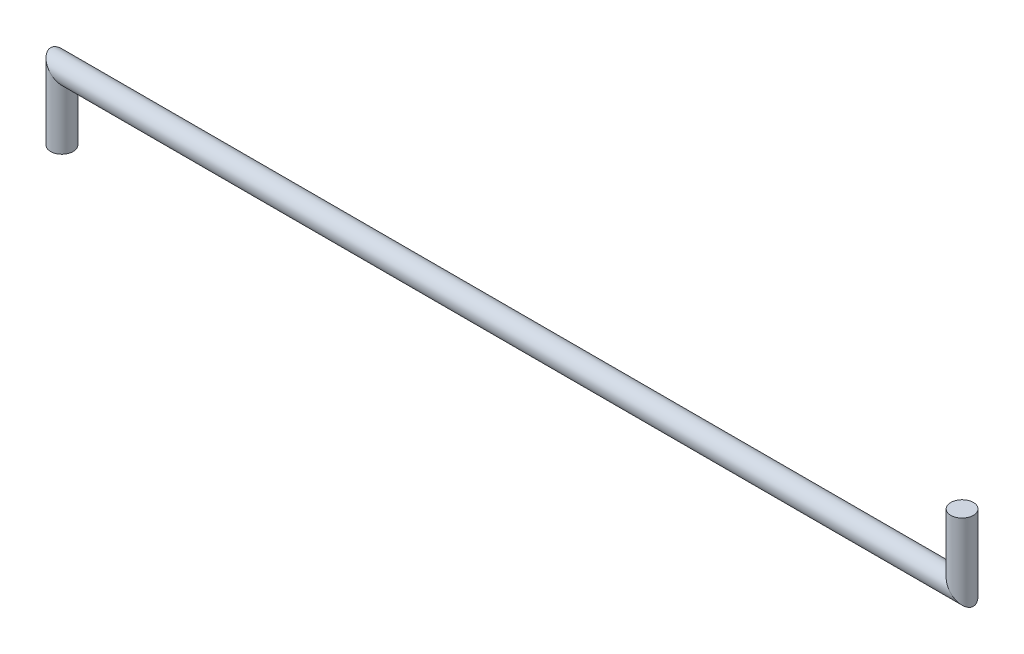
ISO-10303-21;
HEADER;
FILE_DESCRIPTION(('STEP AP214'),'2;1');
FILE_NAME('part.step','',(''),(''),'','','');
FILE_SCHEMA(('AUTOMOTIVE_DESIGN { 1 0 10303 214 1 1 1 1 }'));
ENDSEC;
DATA;
#1=APPLICATION_CONTEXT('core data for automotive mechanical design processes');
#2=APPLICATION_PROTOCOL_DEFINITION('international standard','automotive_design',2000,#1);
#3=PRODUCT_CONTEXT('',#1,'mechanical');
#4=PRODUCT('Part','Part','',(#3));
#5=PRODUCT_RELATED_PRODUCT_CATEGORY('part','',(#4));
#6=PRODUCT_DEFINITION_FORMATION('','',#4);
#7=PRODUCT_DEFINITION_CONTEXT('part definition',#1,'design');
#8=PRODUCT_DEFINITION('design','',#6,#7);
#9=PRODUCT_DEFINITION_SHAPE('','',#8);
#10=(LENGTH_UNIT() NAMED_UNIT(*) SI_UNIT(.MILLI.,.METRE.));
#11=(NAMED_UNIT(*) PLANE_ANGLE_UNIT() SI_UNIT($,.RADIAN.));
#12=(NAMED_UNIT(*) SI_UNIT($,.STERADIAN.) SOLID_ANGLE_UNIT());
#13=UNCERTAINTY_MEASURE_WITH_UNIT(LENGTH_MEASURE(1.E-05),#10,'distance_accuracy_value','');
#14=(GEOMETRIC_REPRESENTATION_CONTEXT(3) GLOBAL_UNCERTAINTY_ASSIGNED_CONTEXT((#13)) GLOBAL_UNIT_ASSIGNED_CONTEXT((#10,
#11,#12)) REPRESENTATION_CONTEXT('',''));
#15=CARTESIAN_POINT('',(0.,0.,0.));
#16=DIRECTION('',(0.,0.,1.));
#17=DIRECTION('',(1.,0.,0.));
#18=AXIS2_PLACEMENT_3D('',#15,#16,#17);
#19=CARTESIAN_POINT('',(-37.0817848266067,7.90140845070422,0.));
#20=DIRECTION('',(0.,1.,0.));
#21=DIRECTION('',(0.,0.,1.));
#22=AXIS2_PLACEMENT_3D('',#19,#20,#21);
#23=PLANE('',#22);
#24=CARTESIAN_POINT('',(-37.0817848266067,7.90140845070422,0.));
#25=DIRECTION('',(0.,1.,0.));
#26=DIRECTION('',(0.,0.,1.));
#27=AXIS2_PLACEMENT_3D('',#24,#25,#26);
#28=CIRCLE('',#27,0.499999999999999);
#29=CARTESIAN_POINT('',(-37.0817848266067,7.90140845070422,0.499999999999999));
#30=VERTEX_POINT('',#29);
#31=EDGE_CURVE('E36',#30,#30,#28,.T.);
#32=ORIENTED_EDGE('',*,*,#31,.T.);
#33=EDGE_LOOP('',(#32));
#34=FACE_BOUND('',#33,.T.);
#35=ADVANCED_FACE('F33',(#34),#23,.T.);
#36=CARTESIAN_POINT('',(-77.0817848266067,1.90140845070423,0.));
#37=DIRECTION('',(0.,1.,0.));
#38=DIRECTION('',(0.,0.,1.));
#39=AXIS2_PLACEMENT_3D('',#36,#37,#38);
#40=PLANE('',#39);
#41=CARTESIAN_POINT('',(-77.0817848266067,1.90140845070423,0.));
#42=DIRECTION('',(0.,1.,0.));
#43=DIRECTION('',(0.,0.,1.));
#44=AXIS2_PLACEMENT_3D('',#41,#42,#43);
#45=CIRCLE('',#44,0.499999999999999);
#46=CARTESIAN_POINT('',(-77.0817848266067,1.90140845070423,0.499999999999999));
#47=VERTEX_POINT('',#46);
#48=EDGE_CURVE('E41',#47,#47,#45,.T.);
#49=ORIENTED_EDGE('',*,*,#48,.F.);
#50=EDGE_LOOP('',(#49));
#51=FACE_BOUND('',#50,.T.);
#52=ADVANCED_FACE('F73',(#51),#40,.F.);
#53=CARTESIAN_POINT('',(-37.0817848266067,3.70140845070422,0.));
#54=DIRECTION('',(0.,1.,0.));
#55=DIRECTION('',(0.,0.,1.));
#56=AXIS2_PLACEMENT_3D('',#53,#54,#55);
#57=CYLINDRICAL_SURFACE('',#56,0.499999999999999);
#58=CARTESIAN_POINT('',(-37.0817848266067,4.90140845070422,0.));
#59=DIRECTION('',(0.707106781186548,0.707106781186548,0.));
#60=DIRECTION('',(0.707106781186548,-0.707106781186548,0.));
#61=AXIS2_PLACEMENT_3D('',#58,#59,#60);
#62=ELLIPSE('',#61,0.707106781186546,0.499999999999999);
#63=CARTESIAN_POINT('',(-36.5817848266067,4.40140845070422,0.));
#64=VERTEX_POINT('',#63);
#65=EDGE_CURVE('E51',#64,#64,#62,.F.);
#66=ORIENTED_EDGE('',*,*,#65,.F.);
#67=EDGE_LOOP('',(#66));
#68=FACE_BOUND('',#67,.T.);
#69=ORIENTED_EDGE('',*,*,#31,.F.);
#70=EDGE_LOOP('',(#69));
#71=FACE_BOUND('',#70,.T.);
#72=ADVANCED_FACE('F68',(#68,#71),#57,.T.);
#73=CARTESIAN_POINT('',(-78.2817848266067,4.90140845070422,0.));
#74=DIRECTION('',(1.,0.,0.));
#75=DIRECTION('',(0.,0.,-1.));
#76=AXIS2_PLACEMENT_3D('',#73,#74,#75);
#77=CYLINDRICAL_SURFACE('',#76,0.499999999999999);
#78=CARTESIAN_POINT('',(-77.0817848266067,4.9014084507042,0.));
#79=DIRECTION('',(0.707106781186548,0.707106781186548,0.));
#80=DIRECTION('',(-0.707106781186548,0.707106781186548,0.));
#81=AXIS2_PLACEMENT_3D('',#78,#79,#80);
#82=ELLIPSE('',#81,0.707106781186546,0.499999999999999);
#83=CARTESIAN_POINT('',(-77.5817848266067,5.4014084507042,0.));
#84=VERTEX_POINT('',#83);
#85=EDGE_CURVE('E11',#84,#84,#82,.F.);
#86=ORIENTED_EDGE('',*,*,#85,.F.);
#87=EDGE_LOOP('',(#86));
#88=FACE_BOUND('',#87,.T.);
#89=ORIENTED_EDGE('',*,*,#65,.T.);
#90=EDGE_LOOP('',(#89));
#91=FACE_BOUND('',#90,.T.);
#92=ADVANCED_FACE('F58',(#88,#91),#77,.T.);
#93=CARTESIAN_POINT('',(-77.0817848266067,1.90140845070423,0.));
#94=DIRECTION('',(0.,1.,0.));
#95=DIRECTION('',(0.,0.,1.));
#96=AXIS2_PLACEMENT_3D('',#93,#94,#95);
#97=CYLINDRICAL_SURFACE('',#96,0.499999999999999);
#98=ORIENTED_EDGE('',*,*,#48,.T.);
#99=EDGE_LOOP('',(#98));
#100=FACE_BOUND('',#99,.T.);
#101=ORIENTED_EDGE('',*,*,#85,.T.);
#102=EDGE_LOOP('',(#101));
#103=FACE_BOUND('',#102,.T.);
#104=ADVANCED_FACE('F61',(#100,#103),#97,.T.);
#105=CLOSED_SHELL('',(#35,#52,#72,#92,#104));
#106=MANIFOLD_SOLID_BREP('B2',#105);
#107=ADVANCED_BREP_SHAPE_REPRESENTATION('',(#18,#106),#14);
#108=SHAPE_DEFINITION_REPRESENTATION(#9,#107);
ENDSEC;
END-ISO-10303-21;
